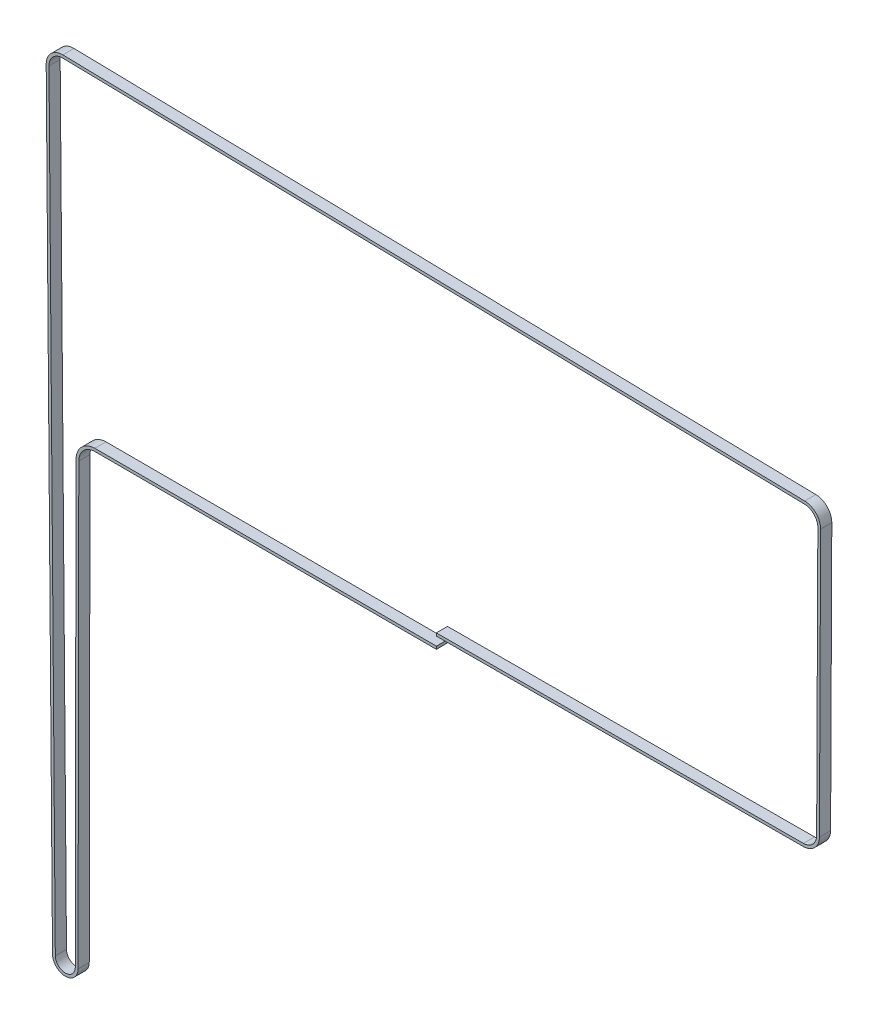
ISO-10303-21;
HEADER;
FILE_DESCRIPTION(('STEP AP214'),'2;1');
FILE_NAME('part.step','',(''),(''),'','','');
FILE_SCHEMA(('AUTOMOTIVE_DESIGN { 1 0 10303 214 1 1 1 1 }'));
ENDSEC;
DATA;
#1=APPLICATION_CONTEXT('core data for automotive mechanical design processes');
#2=APPLICATION_PROTOCOL_DEFINITION('international standard','automotive_design',2000,#1);
#3=PRODUCT_CONTEXT('',#1,'mechanical');
#4=PRODUCT('Part','Part','',(#3));
#5=PRODUCT_RELATED_PRODUCT_CATEGORY('part','',(#4));
#6=PRODUCT_DEFINITION_FORMATION('','',#4);
#7=PRODUCT_DEFINITION_CONTEXT('part definition',#1,'design');
#8=PRODUCT_DEFINITION('design','',#6,#7);
#9=PRODUCT_DEFINITION_SHAPE('','',#8);
#10=(LENGTH_UNIT() NAMED_UNIT(*) SI_UNIT(.MILLI.,.METRE.));
#11=(NAMED_UNIT(*) PLANE_ANGLE_UNIT() SI_UNIT($,.RADIAN.));
#12=(NAMED_UNIT(*) SI_UNIT($,.STERADIAN.) SOLID_ANGLE_UNIT());
#13=UNCERTAINTY_MEASURE_WITH_UNIT(LENGTH_MEASURE(1.E-05),#10,'distance_accuracy_value','');
#14=(GEOMETRIC_REPRESENTATION_CONTEXT(3) GLOBAL_UNCERTAINTY_ASSIGNED_CONTEXT((#13)) GLOBAL_UNIT_ASSIGNED_CONTEXT((#10,
#11,#12)) REPRESENTATION_CONTEXT('',''));
#15=CARTESIAN_POINT('',(0.,0.,0.));
#16=DIRECTION('',(0.,0.,1.));
#17=DIRECTION('',(1.,0.,0.));
#18=AXIS2_PLACEMENT_3D('',#15,#16,#17);
#19=CARTESIAN_POINT('',(396.14458416913,252.975577965564,6.));
#20=DIRECTION('',(0.00333741160895565,-0.999994430826368,0.));
#21=DIRECTION('',(0.999994430826369,0.00333741160895565,0.));
#22=AXIS2_PLACEMENT_3D('',#19,#20,#21);
#23=PLANE('',#22);
#24=DIRECTION('',(-0.999994430826369,-0.00333741160895565,0.));
#25=VECTOR('',#24,1.);
#26=CARTESIAN_POINT('',(396.14458416913,252.975577965564,0.));
#27=LINE('',#26,#25);
#28=CARTESIAN_POINT('',(396.133779649561,252.975541906234,0.));
#29=VERTEX_POINT('',#28);
#30=CARTESIAN_POINT('',(199.115392558749,252.318006792052,0.));
#31=VERTEX_POINT('',#30);
#32=EDGE_CURVE('E225',#29,#31,#27,.T.);
#33=ORIENTED_EDGE('',*,*,#32,.T.);
#34=DIRECTION('',(0.,0.,-1.));
#35=VECTOR('',#34,1.);
#36=CARTESIAN_POINT('',(199.115392558749,252.318006792052,6.));
#37=LINE('',#36,#35);
#38=CARTESIAN_POINT('',(199.115392558749,252.318006792052,6.));
#39=VERTEX_POINT('',#38);
#40=EDGE_CURVE('E11',#39,#31,#37,.T.);
#41=ORIENTED_EDGE('',*,*,#40,.F.);
#42=DIRECTION('',(-0.999994430826369,-0.00333741160895565,0.));
#43=VECTOR('',#42,1.);
#44=CARTESIAN_POINT('',(396.14458416913,252.975577965564,6.));
#45=LINE('',#44,#43);
#46=CARTESIAN_POINT('',(396.133779649561,252.975541906234,6.));
#47=VERTEX_POINT('',#46);
#48=EDGE_CURVE('E138',#47,#39,#45,.T.);
#49=ORIENTED_EDGE('',*,*,#48,.F.);
#50=DIRECTION('',(0.,0.,-1.));
#51=VECTOR('',#50,1.);
#52=CARTESIAN_POINT('',(396.133779649561,252.975541906234,6.));
#53=LINE('',#52,#51);
#54=EDGE_CURVE('E221',#47,#29,#53,.T.);
#55=ORIENTED_EDGE('',*,*,#54,.T.);
#56=EDGE_LOOP('',(#33,#41,#49,#55));
#57=FACE_BOUND('',#56,.T.);
#58=ADVANCED_FACE('F34',(#57),#23,.F.);
#59=CARTESIAN_POINT('',(199.120398676163,250.818015145812,6.));
#60=DIRECTION('',(-0.999994430826368,-0.00333741160901682,0.));
#61=DIRECTION('',(0.00333741160901682,-0.999994430826368,0.));
#62=AXIS2_PLACEMENT_3D('',#59,#60,#61);
#63=PLANE('',#62);
#64=DIRECTION('',(-0.00333741160901682,0.999994430826368,0.));
#65=VECTOR('',#64,1.);
#66=CARTESIAN_POINT('',(199.120398676163,250.818015145812,0.));
#67=LINE('',#66,#65);
#68=CARTESIAN_POINT('',(199.120398676163,250.818015145812,0.));
#69=VERTEX_POINT('',#68);
#70=EDGE_CURVE('E228',#69,#31,#67,.T.);
#71=ORIENTED_EDGE('',*,*,#70,.F.);
#72=DIRECTION('',(0.,0.,-1.));
#73=VECTOR('',#72,1.);
#74=CARTESIAN_POINT('',(199.120398676163,250.818015145812,6.));
#75=LINE('',#74,#73);
#76=CARTESIAN_POINT('',(199.120398676163,250.818015145812,6.));
#77=VERTEX_POINT('',#76);
#78=EDGE_CURVE('E42',#77,#69,#75,.T.);
#79=ORIENTED_EDGE('',*,*,#78,.F.);
#80=DIRECTION('',(-0.00333741160901682,0.999994430826368,0.));
#81=VECTOR('',#80,1.);
#82=CARTESIAN_POINT('',(199.120398676163,250.818015145812,6.));
#83=LINE('',#82,#81);
#84=EDGE_CURVE('E350',#77,#39,#83,.T.);
#85=ORIENTED_EDGE('',*,*,#84,.T.);
#86=ORIENTED_EDGE('',*,*,#40,.T.);
#87=EDGE_LOOP('',(#71,#79,#85,#86));
#88=FACE_BOUND('',#87,.T.);
#89=ADVANCED_FACE('F337',(#88),#63,.T.);
#90=CARTESIAN_POINT('',(396.149590286544,251.475586319324,6.));
#91=DIRECTION('',(0.00333741160895565,-0.999994430826368,0.));
#92=DIRECTION('',(0.999994430826369,0.00333741160895565,0.));
#93=AXIS2_PLACEMENT_3D('',#90,#91,#92);
#94=PLANE('',#93);
#95=DIRECTION('',(-0.999994430826368,-0.00333741160895565,0.));
#96=VECTOR('',#95,1.);
#97=CARTESIAN_POINT('',(396.149590286544,251.475586319324,0.));
#98=LINE('',#97,#96);
#99=CARTESIAN_POINT('',(396.149590286544,251.475586319324,0.));
#100=VERTEX_POINT('',#99);
#101=EDGE_CURVE('E231',#100,#69,#98,.T.);
#102=ORIENTED_EDGE('',*,*,#101,.F.);
#103=DIRECTION('',(0.,0.,-1.));
#104=VECTOR('',#103,1.);
#105=CARTESIAN_POINT('',(396.149590286544,251.475586319324,6.));
#106=LINE('',#105,#104);
#107=CARTESIAN_POINT('',(396.149590286544,251.475586319324,6.));
#108=VERTEX_POINT('',#107);
#109=EDGE_CURVE('E327',#108,#100,#106,.T.);
#110=ORIENTED_EDGE('',*,*,#109,.F.);
#111=DIRECTION('',(-0.999994430826368,-0.00333741160895565,0.));
#112=VECTOR('',#111,1.);
#113=CARTESIAN_POINT('',(396.149590286544,251.475586319324,6.));
#114=LINE('',#113,#112);
#115=EDGE_CURVE('E334',#108,#77,#114,.T.);
#116=ORIENTED_EDGE('',*,*,#115,.T.);
#117=ORIENTED_EDGE('',*,*,#78,.T.);
#118=EDGE_LOOP('',(#102,#110,#116,#117));
#119=FACE_BOUND('',#118,.T.);
#120=ADVANCED_FACE('F332',(#119),#94,.T.);
#121=CARTESIAN_POINT('',(395.999999999829,260.224307525656,6.));
#122=DIRECTION('',(0.,0.,-1.));
#123=DIRECTION('',(-1.,0.,0.));
#124=AXIS2_PLACEMENT_3D('',#121,#122,#123);
#125=CYLINDRICAL_SURFACE('',#124,8.74999999999998);
#126=CARTESIAN_POINT('',(395.999999999829,260.224307525656,0.));
#127=DIRECTION('',(0.,0.,-1.));
#128=DIRECTION('',(-1.,0.,0.));
#129=AXIS2_PLACEMENT_3D('',#126,#127,#128);
#130=CIRCLE('',#129,8.74999999999998);
#131=CARTESIAN_POINT('',(404.749910989488,260.184840158932,0.));
#132=VERTEX_POINT('',#131);
#133=EDGE_CURVE('E234',#132,#100,#130,.T.);
#134=ORIENTED_EDGE('',*,*,#133,.F.);
#135=DIRECTION('',(0.,0.,-1.));
#136=VECTOR('',#135,1.);
#137=CARTESIAN_POINT('',(404.749910989488,260.184840158932,6.));
#138=LINE('',#137,#136);
#139=CARTESIAN_POINT('',(404.749910989488,260.184840158932,6.));
#140=VERTEX_POINT('',#139);
#141=EDGE_CURVE('E325',#140,#132,#138,.T.);
#142=ORIENTED_EDGE('',*,*,#141,.F.);
#143=CARTESIAN_POINT('',(395.999999999829,260.224307525656,6.));
#144=DIRECTION('',(0.,0.,-1.));
#145=DIRECTION('',(-1.,0.,0.));
#146=AXIS2_PLACEMENT_3D('',#143,#144,#145);
#147=CIRCLE('',#146,8.74999999999998);
#148=EDGE_CURVE('E347',#140,#108,#147,.T.);
#149=ORIENTED_EDGE('',*,*,#148,.T.);
#150=ORIENTED_EDGE('',*,*,#109,.T.);
#151=EDGE_LOOP('',(#134,#142,#149,#150));
#152=FACE_BOUND('',#151,.T.);
#153=ADVANCED_FACE('F344',(#152),#125,.T.);
#154=CARTESIAN_POINT('',(405.397119956181,403.670998987911,6.));
#155=DIRECTION('',(0.999989827389656,-0.00451055619698488,0.));
#156=DIRECTION('',(0.00451055619698488,0.999989827389656,0.));
#157=AXIS2_PLACEMENT_3D('',#154,#155,#156);
#158=PLANE('',#157);
#159=DIRECTION('',(-0.00451055619698488,-0.999989827389656,0.));
#160=VECTOR('',#159,1.);
#161=CARTESIAN_POINT('',(405.397119956181,403.670998987911,0.));
#162=LINE('',#161,#160);
#163=CARTESIAN_POINT('',(405.397119956181,403.670998987911,0.));
#164=VERTEX_POINT('',#163);
#165=EDGE_CURVE('E237',#164,#132,#162,.T.);
#166=ORIENTED_EDGE('',*,*,#165,.F.);
#167=DIRECTION('',(0.,0.,-1.));
#168=VECTOR('',#167,1.);
#169=CARTESIAN_POINT('',(405.397119956181,403.670998987911,6.));
#170=LINE('',#169,#168);
#171=CARTESIAN_POINT('',(405.397119956181,403.670998987911,6.));
#172=VERTEX_POINT('',#171);
#173=EDGE_CURVE('E323',#172,#164,#170,.T.);
#174=ORIENTED_EDGE('',*,*,#173,.F.);
#175=DIRECTION('',(-0.00451055619698488,-0.999989827389656,0.));
#176=VECTOR('',#175,1.);
#177=CARTESIAN_POINT('',(405.397119956181,403.670998987911,6.));
#178=LINE('',#177,#176);
#179=EDGE_CURVE('E352',#172,#140,#178,.T.);
#180=ORIENTED_EDGE('',*,*,#179,.T.);
#181=ORIENTED_EDGE('',*,*,#141,.T.);
#182=EDGE_LOOP('',(#166,#174,#180,#181));
#183=FACE_BOUND('',#182,.T.);
#184=ADVANCED_FACE('F428',(#183),#158,.T.);
#185=CARTESIAN_POINT('',(396.647208966521,403.710466354635,6.));
#186=DIRECTION('',(0.,0.,-1.));
#187=DIRECTION('',(-1.,0.,0.));
#188=AXIS2_PLACEMENT_3D('',#185,#186,#187);
#189=CYLINDRICAL_SURFACE('',#188,8.74999999999997);
#190=CARTESIAN_POINT('',(396.647208966521,403.710466354635,0.));
#191=DIRECTION('',(0.,0.,-1.));
#192=DIRECTION('',(-1.,0.,0.));
#193=AXIS2_PLACEMENT_3D('',#190,#191,#192);
#194=CIRCLE('',#193,8.74999999999997);
#195=CARTESIAN_POINT('',(396.829346884032,412.458570479473,0.));
#196=VERTEX_POINT('',#195);
#197=EDGE_CURVE('E240',#196,#164,#194,.T.);
#198=ORIENTED_EDGE('',*,*,#197,.F.);
#199=DIRECTION('',(0.,0.,-1.));
#200=VECTOR('',#199,1.);
#201=CARTESIAN_POINT('',(396.829346884032,412.458570479473,6.));
#202=LINE('',#201,#200);
#203=CARTESIAN_POINT('',(396.829346884032,412.458570479473,6.));
#204=VERTEX_POINT('',#203);
#205=EDGE_CURVE('E321',#204,#196,#202,.T.);
#206=ORIENTED_EDGE('',*,*,#205,.F.);
#207=CARTESIAN_POINT('',(396.647208966521,403.710466354635,6.));
#208=DIRECTION('',(0.,0.,-1.));
#209=DIRECTION('',(-1.,0.,0.));
#210=AXIS2_PLACEMENT_3D('',#207,#208,#209);
#211=CIRCLE('',#210,8.74999999999997);
#212=EDGE_CURVE('E358',#204,#172,#211,.T.);
#213=ORIENTED_EDGE('',*,*,#212,.T.);
#214=ORIENTED_EDGE('',*,*,#173,.T.);
#215=EDGE_LOOP('',(#198,#206,#213,#214));
#216=FACE_BOUND('',#215,.T.);
#217=ADVANCED_FACE('F431',(#216),#189,.T.);
#218=CARTESIAN_POINT('',(-1.31786208224448,420.748104128011,6.));
#219=DIRECTION('',(0.0208157620012069,0.999783328552897,0.));
#220=DIRECTION('',(-0.999783328552897,0.0208157620012069,0.));
#221=AXIS2_PLACEMENT_3D('',#218,#219,#220);
#222=PLANE('',#221);
#223=DIRECTION('',(0.999783328552897,-0.0208157620012069,0.));
#224=VECTOR('',#223,1.);
#225=CARTESIAN_POINT('',(-1.31786208224448,420.748104128011,0.));
#226=LINE('',#225,#224);
#227=CARTESIAN_POINT('',(-1.31786208224448,420.748104128011,0.));
#228=VERTEX_POINT('',#227);
#229=EDGE_CURVE('E243',#228,#196,#226,.T.);
#230=ORIENTED_EDGE('',*,*,#229,.F.);
#231=DIRECTION('',(0.,0.,-1.));
#232=VECTOR('',#231,1.);
#233=CARTESIAN_POINT('',(-1.31786208224448,420.748104128011,6.));
#234=LINE('',#233,#232);
#235=CARTESIAN_POINT('',(-1.31786208224448,420.748104128011,6.));
#236=VERTEX_POINT('',#235);
#237=EDGE_CURVE('E319',#236,#228,#234,.T.);
#238=ORIENTED_EDGE('',*,*,#237,.F.);
#239=DIRECTION('',(0.999783328552897,-0.0208157620012069,0.));
#240=VECTOR('',#239,1.);
#241=CARTESIAN_POINT('',(-1.31786208224448,420.748104128011,6.));
#242=LINE('',#241,#240);
#243=EDGE_CURVE('E361',#236,#204,#242,.T.);
#244=ORIENTED_EDGE('',*,*,#243,.T.);
#245=ORIENTED_EDGE('',*,*,#205,.T.);
#246=EDGE_LOOP('',(#230,#238,#244,#245));
#247=FACE_BOUND('',#246,.T.);
#248=ADVANCED_FACE('F435',(#247),#222,.T.);
#249=CARTESIAN_POINT('',(-1.49999999975504,412.000000003173,6.));
#250=DIRECTION('',(0.,0.,-1.));
#251=DIRECTION('',(-1.,0.,0.));
#252=AXIS2_PLACEMENT_3D('',#249,#250,#251);
#253=CYLINDRICAL_SURFACE('',#252,8.75);
#254=CARTESIAN_POINT('',(-1.49999999975504,412.000000003173,0.));
#255=DIRECTION('',(0.,0.,-1.));
#256=DIRECTION('',(-1.,0.,0.));
#257=AXIS2_PLACEMENT_3D('',#254,#255,#256);
#258=CIRCLE('',#257,8.75);
#259=CARTESIAN_POINT('',(-10.2497035777871,411.927977113939,0.));
#260=VERTEX_POINT('',#259);
#261=EDGE_CURVE('E246',#260,#228,#258,.T.);
#262=ORIENTED_EDGE('',*,*,#261,.F.);
#263=DIRECTION('',(0.,0.,-1.));
#264=VECTOR('',#263,1.);
#265=CARTESIAN_POINT('',(-10.2497035777871,411.927977113939,6.));
#266=LINE('',#265,#264);
#267=CARTESIAN_POINT('',(-10.2497035777871,411.927977113939,6.));
#268=VERTEX_POINT('',#267);
#269=EDGE_CURVE('E317',#268,#260,#266,.T.);
#270=ORIENTED_EDGE('',*,*,#269,.F.);
#271=CARTESIAN_POINT('',(-1.49999999975504,412.000000003173,6.));
#272=DIRECTION('',(0.,0.,-1.));
#273=DIRECTION('',(-1.,0.,0.));
#274=AXIS2_PLACEMENT_3D('',#271,#272,#273);
#275=CIRCLE('',#274,8.75);
#276=EDGE_CURVE('E364',#268,#236,#275,.T.);
#277=ORIENTED_EDGE('',*,*,#276,.T.);
#278=ORIENTED_EDGE('',*,*,#237,.T.);
#279=EDGE_LOOP('',(#262,#270,#277,#278));
#280=FACE_BOUND('',#279,.T.);
#281=ADVANCED_FACE('F439',(#280),#253,.T.);
#282=CARTESIAN_POINT('',(-6.85846764921673,-0.0564552446162825,6.));
#283=DIRECTION('',(-0.999966123203659,-0.00823118734110348,0.));
#284=DIRECTION('',(0.00823118734110348,-0.999966123203659,0.));
#285=AXIS2_PLACEMENT_3D('',#282,#283,#284);
#286=PLANE('',#285);
#287=DIRECTION('',(-0.00823118734110348,0.999966123203659,0.));
#288=VECTOR('',#287,1.);
#289=CARTESIAN_POINT('',(-6.85846764921673,-0.0564552446162825,0.));
#290=LINE('',#289,#288);
#291=CARTESIAN_POINT('',(-6.85846764921673,-0.0564552446162829,0.));
#292=VERTEX_POINT('',#291);
#293=EDGE_CURVE('E249',#292,#260,#290,.T.);
#294=ORIENTED_EDGE('',*,*,#293,.F.);
#295=DIRECTION('',(0.,0.,-1.));
#296=VECTOR('',#295,1.);
#297=CARTESIAN_POINT('',(-6.85846764921673,-0.0564552446162829,6.));
#298=LINE('',#297,#296);
#299=CARTESIAN_POINT('',(-6.85846764921673,-0.0564552446162829,6.));
#300=VERTEX_POINT('',#299);
#301=EDGE_CURVE('E315',#300,#292,#298,.T.);
#302=ORIENTED_EDGE('',*,*,#301,.F.);
#303=DIRECTION('',(-0.00823118734110348,0.999966123203659,0.));
#304=VECTOR('',#303,1.);
#305=CARTESIAN_POINT('',(-6.85846764921673,-0.0564552446162825,6.));
#306=LINE('',#305,#304);
#307=EDGE_CURVE('E367',#300,#268,#306,.T.);
#308=ORIENTED_EDGE('',*,*,#307,.T.);
#309=ORIENTED_EDGE('',*,*,#269,.T.);
#310=EDGE_LOOP('',(#294,#302,#308,#309));
#311=FACE_BOUND('',#310,.T.);
#312=ADVANCED_FACE('F443',(#311),#286,.T.);
#313=CARTESIAN_POINT('',(4.5102810375397E-13,1.38777878078145E-13,6.));
#314=DIRECTION('',(0.,0.,-1.));
#315=DIRECTION('',(-1.,0.,0.));
#316=AXIS2_PLACEMENT_3D('',#313,#314,#315);
#317=CYLINDRICAL_SURFACE('',#316,6.85870000000024);
#318=CARTESIAN_POINT('',(4.5102810375397E-13,1.38777878078145E-13,0.));
#319=DIRECTION('',(0.,0.,-1.));
#320=DIRECTION('',(-1.,0.,0.));
#321=AXIS2_PLACEMENT_3D('',#318,#319,#320);
#322=CIRCLE('',#321,6.85870000000024);
#323=CARTESIAN_POINT('',(6.85869059120771,-0.0113606376756781,0.));
#324=VERTEX_POINT('',#323);
#325=EDGE_CURVE('E252',#324,#292,#322,.T.);
#326=ORIENTED_EDGE('',*,*,#325,.F.);
#327=DIRECTION('',(0.,0.,-1.));
#328=VECTOR('',#327,1.);
#329=CARTESIAN_POINT('',(6.85869059120771,-0.0113606376756781,6.));
#330=LINE('',#329,#328);
#331=CARTESIAN_POINT('',(6.85869059120771,-0.0113606376756781,6.));
#332=VERTEX_POINT('',#331);
#333=EDGE_CURVE('E313',#332,#324,#330,.T.);
#334=ORIENTED_EDGE('',*,*,#333,.F.);
#335=CARTESIAN_POINT('',(4.5102810375397E-13,1.38777878078145E-13,6.));
#336=DIRECTION('',(0.,0.,-1.));
#337=DIRECTION('',(-1.,0.,0.));
#338=AXIS2_PLACEMENT_3D('',#335,#336,#337);
#339=CIRCLE('',#338,6.85870000000024);
#340=EDGE_CURVE('E370',#332,#300,#339,.T.);
#341=ORIENTED_EDGE('',*,*,#340,.T.);
#342=ORIENTED_EDGE('',*,*,#301,.T.);
#343=EDGE_LOOP('',(#326,#334,#341,#342));
#344=FACE_BOUND('',#343,.T.);
#345=ADVANCED_FACE('F447',(#344),#317,.T.);
#346=CARTESIAN_POINT('',(7.25001200309957,236.238800881532,6.));
#347=DIRECTION('',(0.99999862819587,-0.00165638352396946,0.));
#348=DIRECTION('',(0.00165638352396946,0.99999862819587,0.));
#349=AXIS2_PLACEMENT_3D('',#346,#347,#348);
#350=PLANE('',#349);
#351=DIRECTION('',(-0.00165638352396946,-0.99999862819587,0.));
#352=VECTOR('',#351,1.);
#353=CARTESIAN_POINT('',(7.25001200309957,236.238800881532,0.));
#354=LINE('',#353,#352);
#355=CARTESIAN_POINT('',(7.25001200309957,236.238800881532,0.));
#356=VERTEX_POINT('',#355);
#357=EDGE_CURVE('E255',#356,#324,#354,.T.);
#358=ORIENTED_EDGE('',*,*,#357,.F.);
#359=DIRECTION('',(0.,0.,-1.));
#360=VECTOR('',#359,1.);
#361=CARTESIAN_POINT('',(7.25001200309957,236.238800881532,6.));
#362=LINE('',#361,#360);
#363=CARTESIAN_POINT('',(7.25001200309957,236.238800881532,6.));
#364=VERTEX_POINT('',#363);
#365=EDGE_CURVE('E311',#364,#356,#362,.T.);
#366=ORIENTED_EDGE('',*,*,#365,.F.);
#367=DIRECTION('',(-0.00165638352396946,-0.99999862819587,0.));
#368=VECTOR('',#367,1.);
#369=CARTESIAN_POINT('',(7.25001200309957,236.238800881532,6.));
#370=LINE('',#369,#368);
#371=EDGE_CURVE('E373',#364,#332,#370,.T.);
#372=ORIENTED_EDGE('',*,*,#371,.T.);
#373=ORIENTED_EDGE('',*,*,#333,.T.);
#374=EDGE_LOOP('',(#358,#366,#372,#373));
#375=FACE_BOUND('',#374,.T.);
#376=ADVANCED_FACE('F451',(#375),#350,.T.);
#377=CARTESIAN_POINT('',(15.9999999998134,236.224307525697,6.));
#378=DIRECTION('',(0.,0.,-1.));
#379=DIRECTION('',(-1.,0.,0.));
#380=AXIS2_PLACEMENT_3D('',#377,#378,#379);
#381=CYLINDRICAL_SURFACE('',#380,8.75);
#382=CARTESIAN_POINT('',(15.9999999998134,236.224307525697,0.));
#383=DIRECTION('',(0.,0.,1.));
#384=DIRECTION('',(1.,0.,0.));
#385=AXIS2_PLACEMENT_3D('',#382,#383,#384);
#386=CIRCLE('',#385,8.75);
#387=CARTESIAN_POINT('',(15.8504097130987,244.973028732029,0.));
#388=VERTEX_POINT('',#387);
#389=EDGE_CURVE('E258',#388,#356,#386,.T.);
#390=ORIENTED_EDGE('',*,*,#389,.F.);
#391=DIRECTION('',(0.,0.,-1.));
#392=VECTOR('',#391,1.);
#393=CARTESIAN_POINT('',(15.8504097130987,244.973028732029,6.));
#394=LINE('',#393,#392);
#395=CARTESIAN_POINT('',(15.8504097130987,244.973028732029,6.));
#396=VERTEX_POINT('',#395);
#397=EDGE_CURVE('E309',#396,#388,#394,.T.);
#398=ORIENTED_EDGE('',*,*,#397,.F.);
#399=CARTESIAN_POINT('',(15.9999999998134,236.224307525697,6.));
#400=DIRECTION('',(0.,0.,1.));
#401=DIRECTION('',(1.,0.,0.));
#402=AXIS2_PLACEMENT_3D('',#399,#400,#401);
#403=CIRCLE('',#402,8.75);
#404=EDGE_CURVE('E376',#396,#364,#403,.T.);
#405=ORIENTED_EDGE('',*,*,#404,.T.);
#406=ORIENTED_EDGE('',*,*,#365,.T.);
#407=EDGE_LOOP('',(#390,#398,#405,#406));
#408=FACE_BOUND('',#407,.T.);
#409=ADVANCED_FACE('F455',(#408),#381,.F.);
#410=CARTESIAN_POINT('',(15.8504097130987,244.973028732029,6.));
#411=DIRECTION('',(-0.00165638352396955,-0.99999862819587,0.));
#412=DIRECTION('',(0.99999862819587,-0.00165638352396955,0.));
#413=AXIS2_PLACEMENT_3D('',#410,#411,#412);
#414=PLANE('',#413);
#415=DIRECTION('',(-0.99999862819587,0.00165638352396955,0.));
#416=VECTOR('',#415,1.);
#417=CARTESIAN_POINT('',(15.8504097130987,244.973028732029,0.));
#418=LINE('',#417,#416);
#419=CARTESIAN_POINT('',(199.171010965997,244.669379091961,0.));
#420=VERTEX_POINT('',#419);
#421=EDGE_CURVE('E261',#420,#388,#418,.T.);
#422=ORIENTED_EDGE('',*,*,#421,.F.);
#423=DIRECTION('',(0.,0.,-1.));
#424=VECTOR('',#423,1.);
#425=CARTESIAN_POINT('',(199.171010965997,244.669379091961,6.));
#426=LINE('',#425,#424);
#427=CARTESIAN_POINT('',(199.171010965997,244.669379091961,6.));
#428=VERTEX_POINT('',#427);
#429=EDGE_CURVE('E307',#428,#420,#426,.T.);
#430=ORIENTED_EDGE('',*,*,#429,.F.);
#431=DIRECTION('',(-0.99999862819587,0.00165638352396955,0.));
#432=VECTOR('',#431,1.);
#433=CARTESIAN_POINT('',(15.8504097130987,244.973028732029,6.));
#434=LINE('',#433,#432);
#435=EDGE_CURVE('E379',#428,#396,#434,.T.);
#436=ORIENTED_EDGE('',*,*,#435,.T.);
#437=ORIENTED_EDGE('',*,*,#397,.T.);
#438=EDGE_LOOP('',(#422,#430,#436,#437));
#439=FACE_BOUND('',#438,.T.);
#440=ADVANCED_FACE('F459',(#439),#414,.T.);
#441=CARTESIAN_POINT('',(199.173495541283,246.169377034255,6.));
#442=DIRECTION('',(0.99999862819587,-0.00165638352398838,0.));
#443=DIRECTION('',(0.00165638352398838,0.99999862819587,0.));
#444=AXIS2_PLACEMENT_3D('',#441,#442,#443);
#445=PLANE('',#444);
#446=DIRECTION('',(-0.00165638352398838,-0.99999862819587,0.));
#447=VECTOR('',#446,1.);
#448=CARTESIAN_POINT('',(199.173495541283,246.169377034255,0.));
#449=LINE('',#448,#447);
#450=CARTESIAN_POINT('',(199.173495541283,246.169377034255,0.));
#451=VERTEX_POINT('',#450);
#452=EDGE_CURVE('E264',#451,#420,#449,.T.);
#453=ORIENTED_EDGE('',*,*,#452,.F.);
#454=DIRECTION('',(0.,0.,-1.));
#455=VECTOR('',#454,1.);
#456=CARTESIAN_POINT('',(199.173495541283,246.169377034255,6.));
#457=LINE('',#456,#455);
#458=CARTESIAN_POINT('',(199.173495541283,246.169377034255,6.));
#459=VERTEX_POINT('',#458);
#460=EDGE_CURVE('E305',#459,#451,#457,.T.);
#461=ORIENTED_EDGE('',*,*,#460,.F.);
#462=DIRECTION('',(-0.00165638352398838,-0.99999862819587,0.));
#463=VECTOR('',#462,1.);
#464=CARTESIAN_POINT('',(199.173495541283,246.169377034255,6.));
#465=LINE('',#464,#463);
#466=EDGE_CURVE('E382',#459,#428,#465,.T.);
#467=ORIENTED_EDGE('',*,*,#466,.T.);
#468=ORIENTED_EDGE('',*,*,#429,.T.);
#469=EDGE_LOOP('',(#453,#461,#467,#468));
#470=FACE_BOUND('',#469,.T.);
#471=ADVANCED_FACE('F463',(#470),#445,.T.);
#472=CARTESIAN_POINT('',(15.8528942883846,246.473026674323,6.));
#473=DIRECTION('',(-0.00165638352396955,-0.99999862819587,0.));
#474=DIRECTION('',(0.99999862819587,-0.00165638352396955,0.));
#475=AXIS2_PLACEMENT_3D('',#472,#473,#474);
#476=PLANE('',#475);
#477=DIRECTION('',(-0.99999862819587,0.00165638352396955,0.));
#478=VECTOR('',#477,1.);
#479=CARTESIAN_POINT('',(15.8528942883846,246.473026674323,0.));
#480=LINE('',#479,#478);
#481=CARTESIAN_POINT('',(15.8393850814082,246.473049050781,0.));
#482=VERTEX_POINT('',#481);
#483=EDGE_CURVE('E267',#451,#482,#480,.T.);
#484=ORIENTED_EDGE('',*,*,#483,.T.);
#485=DIRECTION('',(0.,0.,-1.));
#486=VECTOR('',#485,1.);
#487=CARTESIAN_POINT('',(15.8393850814082,246.473049050781,6.));
#488=LINE('',#487,#486);
#489=CARTESIAN_POINT('',(15.8393850814082,246.473049050781,6.));
#490=VERTEX_POINT('',#489);
#491=EDGE_CURVE('E302',#490,#482,#488,.T.);
#492=ORIENTED_EDGE('',*,*,#491,.F.);
#493=DIRECTION('',(-0.99999862819587,0.00165638352396955,0.));
#494=VECTOR('',#493,1.);
#495=CARTESIAN_POINT('',(15.8528942883846,246.473026674323,6.));
#496=LINE('',#495,#494);
#497=EDGE_CURVE('E385',#459,#490,#496,.T.);
#498=ORIENTED_EDGE('',*,*,#497,.F.);
#499=ORIENTED_EDGE('',*,*,#460,.T.);
#500=EDGE_LOOP('',(#484,#492,#498,#499));
#501=FACE_BOUND('',#500,.T.);
#502=ADVANCED_FACE('F467',(#501),#476,.F.);
#503=CARTESIAN_POINT('',(15.9999999998134,236.224307525697,6.));
#504=DIRECTION('',(0.,0.,-1.));
#505=DIRECTION('',(-1.,0.,0.));
#506=AXIS2_PLACEMENT_3D('',#503,#504,#505);
#507=CYLINDRICAL_SURFACE('',#506,10.25);
#508=CARTESIAN_POINT('',(15.9999999998134,236.224307525697,0.));
#509=DIRECTION('',(0.,0.,1.));
#510=DIRECTION('',(1.,0.,0.));
#511=AXIS2_PLACEMENT_3D('',#508,#509,#510);
#512=CIRCLE('',#511,10.25);
#513=CARTESIAN_POINT('',(5.75001406080577,236.241285456818,0.));
#514=VERTEX_POINT('',#513);
#515=EDGE_CURVE('E269',#482,#514,#512,.T.);
#516=ORIENTED_EDGE('',*,*,#515,.T.);
#517=DIRECTION('',(0.,0.,-1.));
#518=VECTOR('',#517,1.);
#519=CARTESIAN_POINT('',(5.75001406080577,236.241285456818,6.));
#520=LINE('',#519,#518);
#521=CARTESIAN_POINT('',(5.75001406080577,236.241285456818,6.));
#522=VERTEX_POINT('',#521);
#523=EDGE_CURVE('E299',#522,#514,#520,.T.);
#524=ORIENTED_EDGE('',*,*,#523,.F.);
#525=CARTESIAN_POINT('',(15.9999999998134,236.224307525697,6.));
#526=DIRECTION('',(0.,0.,1.));
#527=DIRECTION('',(1.,0.,0.));
#528=AXIS2_PLACEMENT_3D('',#525,#526,#527);
#529=CIRCLE('',#528,10.25);
#530=EDGE_CURVE('E387',#490,#522,#529,.T.);
#531=ORIENTED_EDGE('',*,*,#530,.F.);
#532=ORIENTED_EDGE('',*,*,#491,.T.);
#533=EDGE_LOOP('',(#516,#524,#531,#532));
#534=FACE_BOUND('',#533,.T.);
#535=ADVANCED_FACE('F471',(#534),#507,.T.);
#536=CARTESIAN_POINT('',(5.75001406080577,236.241285456818,6.));
#537=DIRECTION('',(0.99999862819587,-0.00165638352396946,0.));
#538=DIRECTION('',(0.00165638352396946,0.99999862819587,0.));
#539=AXIS2_PLACEMENT_3D('',#536,#537,#538);
#540=PLANE('',#539);
#541=DIRECTION('',(-0.00165638352396946,-0.99999862819587,0.));
#542=VECTOR('',#541,1.);
#543=CARTESIAN_POINT('',(5.75001406080577,236.241285456818,0.));
#544=LINE('',#543,#542);
#545=CARTESIAN_POINT('',(5.3586926489139,-0.00887606238973143,0.));
#546=VERTEX_POINT('',#545);
#547=EDGE_CURVE('E271',#514,#546,#544,.T.);
#548=ORIENTED_EDGE('',*,*,#547,.T.);
#549=DIRECTION('',(0.,0.,-1.));
#550=VECTOR('',#549,1.);
#551=CARTESIAN_POINT('',(5.3586926489139,-0.00887606238973143,6.));
#552=LINE('',#551,#550);
#553=CARTESIAN_POINT('',(5.3586926489139,-0.00887606238973143,6.));
#554=VERTEX_POINT('',#553);
#555=EDGE_CURVE('E296',#554,#546,#552,.T.);
#556=ORIENTED_EDGE('',*,*,#555,.F.);
#557=DIRECTION('',(-0.00165638352396946,-0.99999862819587,0.));
#558=VECTOR('',#557,1.);
#559=CARTESIAN_POINT('',(5.75001406080577,236.241285456818,6.));
#560=LINE('',#559,#558);
#561=EDGE_CURVE('E389',#522,#554,#560,.T.);
#562=ORIENTED_EDGE('',*,*,#561,.F.);
#563=ORIENTED_EDGE('',*,*,#523,.T.);
#564=EDGE_LOOP('',(#548,#556,#562,#563));
#565=FACE_BOUND('',#564,.T.);
#566=ADVANCED_FACE('F475',(#565),#540,.F.);
#567=CARTESIAN_POINT('',(4.5102810375397E-13,1.38777878078145E-13,6.));
#568=DIRECTION('',(0.,0.,-1.));
#569=DIRECTION('',(-1.,0.,0.));
#570=AXIS2_PLACEMENT_3D('',#567,#568,#569);
#571=CYLINDRICAL_SURFACE('',#570,5.35870000000024);
#572=CARTESIAN_POINT('',(4.5102810375397E-13,1.38777878078145E-13,0.));
#573=DIRECTION('',(0.,0.,1.));
#574=DIRECTION('',(1.,0.,0.));
#575=AXIS2_PLACEMENT_3D('',#572,#573,#574);
#576=CIRCLE('',#575,5.35870000000024);
#577=CARTESIAN_POINT('',(-5.35851846441124,-0.0441084636046277,0.));
#578=VERTEX_POINT('',#577);
#579=EDGE_CURVE('E273',#546,#578,#576,.F.);
#580=ORIENTED_EDGE('',*,*,#579,.T.);
#581=DIRECTION('',(0.,0.,-1.));
#582=VECTOR('',#581,1.);
#583=CARTESIAN_POINT('',(-5.35851846441124,-0.0441084636046277,6.));
#584=LINE('',#583,#582);
#585=CARTESIAN_POINT('',(-5.35851846441124,-0.0441084636046277,6.));
#586=VERTEX_POINT('',#585);
#587=EDGE_CURVE('E293',#586,#578,#584,.T.);
#588=ORIENTED_EDGE('',*,*,#587,.F.);
#589=CARTESIAN_POINT('',(4.5102810375397E-13,1.38777878078145E-13,6.));
#590=DIRECTION('',(0.,0.,1.));
#591=DIRECTION('',(1.,0.,0.));
#592=AXIS2_PLACEMENT_3D('',#589,#590,#591);
#593=CIRCLE('',#592,5.35870000000024);
#594=EDGE_CURVE('E391',#554,#586,#593,.F.);
#595=ORIENTED_EDGE('',*,*,#594,.F.);
#596=ORIENTED_EDGE('',*,*,#555,.T.);
#597=EDGE_LOOP('',(#580,#588,#595,#596));
#598=FACE_BOUND('',#597,.T.);
#599=ADVANCED_FACE('F479',(#598),#571,.F.);
#600=CARTESIAN_POINT('',(-5.35851846441124,-0.0441084636046273,6.));
#601=DIRECTION('',(-0.999966123203659,-0.00823118734110348,0.));
#602=DIRECTION('',(0.00823118734110348,-0.999966123203659,0.));
#603=AXIS2_PLACEMENT_3D('',#600,#601,#602);
#604=PLANE('',#603);
#605=DIRECTION('',(-0.00823118734110348,0.999966123203659,0.));
#606=VECTOR('',#605,1.);
#607=CARTESIAN_POINT('',(-5.35851846441124,-0.0441084636046273,0.));
#608=LINE('',#607,#606);
#609=CARTESIAN_POINT('',(-8.74975439298157,411.94032389495,0.));
#610=VERTEX_POINT('',#609);
#611=EDGE_CURVE('E275',#578,#610,#608,.T.);
#612=ORIENTED_EDGE('',*,*,#611,.T.);
#613=DIRECTION('',(0.,0.,-1.));
#614=VECTOR('',#613,1.);
#615=CARTESIAN_POINT('',(-8.74975439298157,411.94032389495,6.));
#616=LINE('',#615,#614);
#617=CARTESIAN_POINT('',(-8.74975439298157,411.94032389495,6.));
#618=VERTEX_POINT('',#617);
#619=EDGE_CURVE('E290',#618,#610,#616,.T.);
#620=ORIENTED_EDGE('',*,*,#619,.F.);
#621=DIRECTION('',(-0.00823118734110348,0.999966123203659,0.));
#622=VECTOR('',#621,1.);
#623=CARTESIAN_POINT('',(-5.35851846441124,-0.0441084636046273,6.));
#624=LINE('',#623,#622);
#625=EDGE_CURVE('E393',#586,#618,#624,.T.);
#626=ORIENTED_EDGE('',*,*,#625,.F.);
#627=ORIENTED_EDGE('',*,*,#587,.T.);
#628=EDGE_LOOP('',(#612,#620,#626,#627));
#629=FACE_BOUND('',#628,.T.);
#630=ADVANCED_FACE('F483',(#629),#604,.F.);
#631=CARTESIAN_POINT('',(-1.49999999975504,412.000000003173,6.));
#632=DIRECTION('',(0.,0.,-1.));
#633=DIRECTION('',(-1.,0.,0.));
#634=AXIS2_PLACEMENT_3D('',#631,#632,#633);
#635=CYLINDRICAL_SURFACE('',#634,7.25);
#636=CARTESIAN_POINT('',(-1.49999999975504,412.000000003173,0.));
#637=DIRECTION('',(0.,0.,1.));
#638=DIRECTION('',(1.,0.,0.));
#639=AXIS2_PLACEMENT_3D('',#636,#637,#638);
#640=CIRCLE('',#639,7.25);
#641=CARTESIAN_POINT('',(-1.34908572524629,419.248429135182,0.));
#642=VERTEX_POINT('',#641);
#643=EDGE_CURVE('E277',#610,#642,#640,.F.);
#644=ORIENTED_EDGE('',*,*,#643,.T.);
#645=DIRECTION('',(0.,0.,-1.));
#646=VECTOR('',#645,1.);
#647=CARTESIAN_POINT('',(-1.34908572524629,419.248429135182,6.));
#648=LINE('',#647,#646);
#649=CARTESIAN_POINT('',(-1.34908572524629,419.248429135182,6.));
#650=VERTEX_POINT('',#649);
#651=EDGE_CURVE('E287',#650,#642,#648,.T.);
#652=ORIENTED_EDGE('',*,*,#651,.F.);
#653=CARTESIAN_POINT('',(-1.49999999975504,412.000000003173,6.));
#654=DIRECTION('',(0.,0.,1.));
#655=DIRECTION('',(1.,0.,0.));
#656=AXIS2_PLACEMENT_3D('',#653,#654,#655);
#657=CIRCLE('',#656,7.25);
#658=EDGE_CURVE('E395',#618,#650,#657,.F.);
#659=ORIENTED_EDGE('',*,*,#658,.F.);
#660=ORIENTED_EDGE('',*,*,#619,.T.);
#661=EDGE_LOOP('',(#644,#652,#659,#660));
#662=FACE_BOUND('',#661,.T.);
#663=ADVANCED_FACE('F401',(#662),#635,.F.);
#664=CARTESIAN_POINT('',(-1.34908572524629,419.248429135182,6.));
#665=DIRECTION('',(0.0208157620012069,0.999783328552897,0.));
#666=DIRECTION('',(-0.999783328552897,0.0208157620012069,0.));
#667=AXIS2_PLACEMENT_3D('',#664,#665,#666);
#668=PLANE('',#667);
#669=DIRECTION('',(0.999783328552897,-0.0208157620012069,0.));
#670=VECTOR('',#669,1.);
#671=CARTESIAN_POINT('',(-1.34908572524629,419.248429135182,0.));
#672=LINE('',#671,#670);
#673=CARTESIAN_POINT('',(396.79812324103,410.958895486643,0.));
#674=VERTEX_POINT('',#673);
#675=EDGE_CURVE('E279',#642,#674,#672,.T.);
#676=ORIENTED_EDGE('',*,*,#675,.T.);
#677=DIRECTION('',(0.,0.,-1.));
#678=VECTOR('',#677,1.);
#679=CARTESIAN_POINT('',(396.79812324103,410.958895486643,6.));
#680=LINE('',#679,#678);
#681=CARTESIAN_POINT('',(396.79812324103,410.958895486643,6.));
#682=VERTEX_POINT('',#681);
#683=EDGE_CURVE('E216',#682,#674,#680,.T.);
#684=ORIENTED_EDGE('',*,*,#683,.F.);
#685=DIRECTION('',(0.999783328552897,-0.0208157620012069,0.));
#686=VECTOR('',#685,1.);
#687=CARTESIAN_POINT('',(-1.34908572524629,419.248429135182,6.));
#688=LINE('',#687,#686);
#689=EDGE_CURVE('E207',#650,#682,#688,.T.);
#690=ORIENTED_EDGE('',*,*,#689,.F.);
#691=ORIENTED_EDGE('',*,*,#651,.T.);
#692=EDGE_LOOP('',(#676,#684,#690,#691));
#693=FACE_BOUND('',#692,.T.);
#694=ADVANCED_FACE('F405',(#693),#668,.F.);
#695=CARTESIAN_POINT('',(396.647208966521,403.710466354635,6.));
#696=DIRECTION('',(0.,0.,-1.));
#697=DIRECTION('',(-1.,0.,0.));
#698=AXIS2_PLACEMENT_3D('',#695,#696,#697);
#699=CYLINDRICAL_SURFACE('',#698,7.24999999999997);
#700=CARTESIAN_POINT('',(396.647208966521,403.710466354635,0.));
#701=DIRECTION('',(0.,0.,1.));
#702=DIRECTION('',(1.,0.,0.));
#703=AXIS2_PLACEMENT_3D('',#700,#701,#702);
#704=CIRCLE('',#703,7.24999999999997);
#705=CARTESIAN_POINT('',(403.897135215096,403.677764822207,0.));
#706=VERTEX_POINT('',#705);
#707=EDGE_CURVE('E215',#674,#706,#704,.F.);
#708=ORIENTED_EDGE('',*,*,#707,.T.);
#709=DIRECTION('',(0.,0.,-1.));
#710=VECTOR('',#709,1.);
#711=CARTESIAN_POINT('',(403.897135215096,403.677764822207,6.));
#712=LINE('',#711,#710);
#713=CARTESIAN_POINT('',(403.897135215096,403.677764822207,6.));
#714=VERTEX_POINT('',#713);
#715=EDGE_CURVE('E212',#714,#706,#712,.T.);
#716=ORIENTED_EDGE('',*,*,#715,.F.);
#717=CARTESIAN_POINT('',(396.647208966521,403.710466354635,6.));
#718=DIRECTION('',(0.,0.,1.));
#719=DIRECTION('',(1.,0.,0.));
#720=AXIS2_PLACEMENT_3D('',#717,#718,#719);
#721=CIRCLE('',#720,7.24999999999997);
#722=EDGE_CURVE('E201',#682,#714,#721,.F.);
#723=ORIENTED_EDGE('',*,*,#722,.F.);
#724=ORIENTED_EDGE('',*,*,#683,.T.);
#725=EDGE_LOOP('',(#708,#716,#723,#724));
#726=FACE_BOUND('',#725,.T.);
#727=ADVANCED_FACE('F213',(#726),#699,.F.);
#728=CARTESIAN_POINT('',(403.897135215096,403.677764822207,6.));
#729=DIRECTION('',(0.999989827389656,-0.00451055619698488,0.));
#730=DIRECTION('',(0.00451055619698488,0.999989827389656,0.));
#731=AXIS2_PLACEMENT_3D('',#728,#729,#730);
#732=PLANE('',#731);
#733=DIRECTION('',(-0.00451055619698488,-0.999989827389656,0.));
#734=VECTOR('',#733,1.);
#735=CARTESIAN_POINT('',(403.897135215096,403.677764822207,0.));
#736=LINE('',#735,#734);
#737=CARTESIAN_POINT('',(403.249926248404,260.191605993228,0.));
#738=VERTEX_POINT('',#737);
#739=EDGE_CURVE('E126',#706,#738,#736,.T.);
#740=ORIENTED_EDGE('',*,*,#739,.T.);
#741=DIRECTION('',(0.,0.,-1.));
#742=VECTOR('',#741,1.);
#743=CARTESIAN_POINT('',(403.249926248404,260.191605993228,6.));
#744=LINE('',#743,#742);
#745=CARTESIAN_POINT('',(403.249926248404,260.191605993228,6.));
#746=VERTEX_POINT('',#745);
#747=EDGE_CURVE('E217',#746,#738,#744,.T.);
#748=ORIENTED_EDGE('',*,*,#747,.F.);
#749=DIRECTION('',(-0.00451055619698488,-0.999989827389656,0.));
#750=VECTOR('',#749,1.);
#751=CARTESIAN_POINT('',(403.897135215096,403.677764822207,6.));
#752=LINE('',#751,#750);
#753=EDGE_CURVE('E205',#714,#746,#752,.T.);
#754=ORIENTED_EDGE('',*,*,#753,.F.);
#755=ORIENTED_EDGE('',*,*,#715,.T.);
#756=EDGE_LOOP('',(#740,#748,#754,#755));
#757=FACE_BOUND('',#756,.T.);
#758=ADVANCED_FACE('F219',(#757),#732,.F.);
#759=CARTESIAN_POINT('',(395.999999999829,260.224307525656,6.));
#760=DIRECTION('',(0.,0.,-1.));
#761=DIRECTION('',(-1.,0.,0.));
#762=AXIS2_PLACEMENT_3D('',#759,#760,#761);
#763=CYLINDRICAL_SURFACE('',#762,7.24999999999998);
#764=CARTESIAN_POINT('',(395.999999999829,260.224307525656,0.));
#765=DIRECTION('',(0.,0.,1.));
#766=DIRECTION('',(1.,0.,0.));
#767=AXIS2_PLACEMENT_3D('',#764,#765,#766);
#768=CIRCLE('',#767,7.24999999999998);
#769=EDGE_CURVE('E132',#738,#29,#768,.F.);
#770=ORIENTED_EDGE('',*,*,#769,.T.);
#771=ORIENTED_EDGE('',*,*,#54,.F.);
#772=CARTESIAN_POINT('',(395.999999999829,260.224307525656,6.));
#773=DIRECTION('',(0.,0.,1.));
#774=DIRECTION('',(1.,0.,0.));
#775=AXIS2_PLACEMENT_3D('',#772,#773,#774);
#776=CIRCLE('',#775,7.24999999999998);
#777=EDGE_CURVE('E50',#746,#47,#776,.F.);
#778=ORIENTED_EDGE('',*,*,#777,.F.);
#779=ORIENTED_EDGE('',*,*,#747,.T.);
#780=EDGE_LOOP('',(#770,#771,#778,#779));
#781=FACE_BOUND('',#780,.T.);
#782=ADVANCED_FACE('F407',(#781),#763,.F.);
#783=CARTESIAN_POINT('',(395.999999999829,260.224307525656,6.));
#784=DIRECTION('',(0.,0.,-1.));
#785=DIRECTION('',(-1.,0.,0.));
#786=AXIS2_PLACEMENT_3D('',#783,#784,#785);
#787=PLANE('',#786);
#788=ORIENTED_EDGE('',*,*,#48,.T.);
#789=ORIENTED_EDGE('',*,*,#84,.F.);
#790=ORIENTED_EDGE('',*,*,#115,.F.);
#791=ORIENTED_EDGE('',*,*,#148,.F.);
#792=ORIENTED_EDGE('',*,*,#179,.F.);
#793=ORIENTED_EDGE('',*,*,#212,.F.);
#794=ORIENTED_EDGE('',*,*,#243,.F.);
#795=ORIENTED_EDGE('',*,*,#276,.F.);
#796=ORIENTED_EDGE('',*,*,#307,.F.);
#797=ORIENTED_EDGE('',*,*,#340,.F.);
#798=ORIENTED_EDGE('',*,*,#371,.F.);
#799=ORIENTED_EDGE('',*,*,#404,.F.);
#800=ORIENTED_EDGE('',*,*,#435,.F.);
#801=ORIENTED_EDGE('',*,*,#466,.F.);
#802=ORIENTED_EDGE('',*,*,#497,.T.);
#803=ORIENTED_EDGE('',*,*,#530,.T.);
#804=ORIENTED_EDGE('',*,*,#561,.T.);
#805=ORIENTED_EDGE('',*,*,#594,.T.);
#806=ORIENTED_EDGE('',*,*,#625,.T.);
#807=ORIENTED_EDGE('',*,*,#658,.T.);
#808=ORIENTED_EDGE('',*,*,#689,.T.);
#809=ORIENTED_EDGE('',*,*,#722,.T.);
#810=ORIENTED_EDGE('',*,*,#753,.T.);
#811=ORIENTED_EDGE('',*,*,#777,.T.);
#812=EDGE_LOOP('',(#788,#789,#790,#791,#792,#793,#794,#795,#796,#797,#798,#799,#800,#801,#802,
#803,#804,#805,#806,#807,#808,#809,#810,#811));
#813=FACE_BOUND('',#812,.T.);
#814=ADVANCED_FACE('F203',(#813),#787,.F.);
#815=CARTESIAN_POINT('',(395.999999999829,260.224307525656,0.));
#816=DIRECTION('',(0.,0.,-1.));
#817=DIRECTION('',(-1.,0.,0.));
#818=AXIS2_PLACEMENT_3D('',#815,#816,#817);
#819=PLANE('',#818);
#820=ORIENTED_EDGE('',*,*,#32,.F.);
#821=ORIENTED_EDGE('',*,*,#769,.F.);
#822=ORIENTED_EDGE('',*,*,#739,.F.);
#823=ORIENTED_EDGE('',*,*,#707,.F.);
#824=ORIENTED_EDGE('',*,*,#675,.F.);
#825=ORIENTED_EDGE('',*,*,#643,.F.);
#826=ORIENTED_EDGE('',*,*,#611,.F.);
#827=ORIENTED_EDGE('',*,*,#579,.F.);
#828=ORIENTED_EDGE('',*,*,#547,.F.);
#829=ORIENTED_EDGE('',*,*,#515,.F.);
#830=ORIENTED_EDGE('',*,*,#483,.F.);
#831=ORIENTED_EDGE('',*,*,#452,.T.);
#832=ORIENTED_EDGE('',*,*,#421,.T.);
#833=ORIENTED_EDGE('',*,*,#389,.T.);
#834=ORIENTED_EDGE('',*,*,#357,.T.);
#835=ORIENTED_EDGE('',*,*,#325,.T.);
#836=ORIENTED_EDGE('',*,*,#293,.T.);
#837=ORIENTED_EDGE('',*,*,#261,.T.);
#838=ORIENTED_EDGE('',*,*,#229,.T.);
#839=ORIENTED_EDGE('',*,*,#197,.T.);
#840=ORIENTED_EDGE('',*,*,#165,.T.);
#841=ORIENTED_EDGE('',*,*,#133,.T.);
#842=ORIENTED_EDGE('',*,*,#101,.T.);
#843=ORIENTED_EDGE('',*,*,#70,.T.);
#844=EDGE_LOOP('',(#820,#821,#822,#823,#824,#825,#826,#827,#828,#829,#830,#831,#832,#833,#834,
#835,#836,#837,#838,#839,#840,#841,#842,#843));
#845=FACE_BOUND('',#844,.T.);
#846=ADVANCED_FACE('F340',(#845),#819,.T.);
#847=CLOSED_SHELL('',(#58,#89,#120,#153,#184,#217,#248,#281,#312,#345,#376,#409,#440,#471,#502,
#535,#566,#599,#630,#663,#694,#727,#758,#782,#814,#846));
#848=MANIFOLD_SOLID_BREP('B2',#847);
#849=ADVANCED_BREP_SHAPE_REPRESENTATION('',(#18,#848),#14);
#850=SHAPE_DEFINITION_REPRESENTATION(#9,#849);
ENDSEC;
END-ISO-10303-21;
